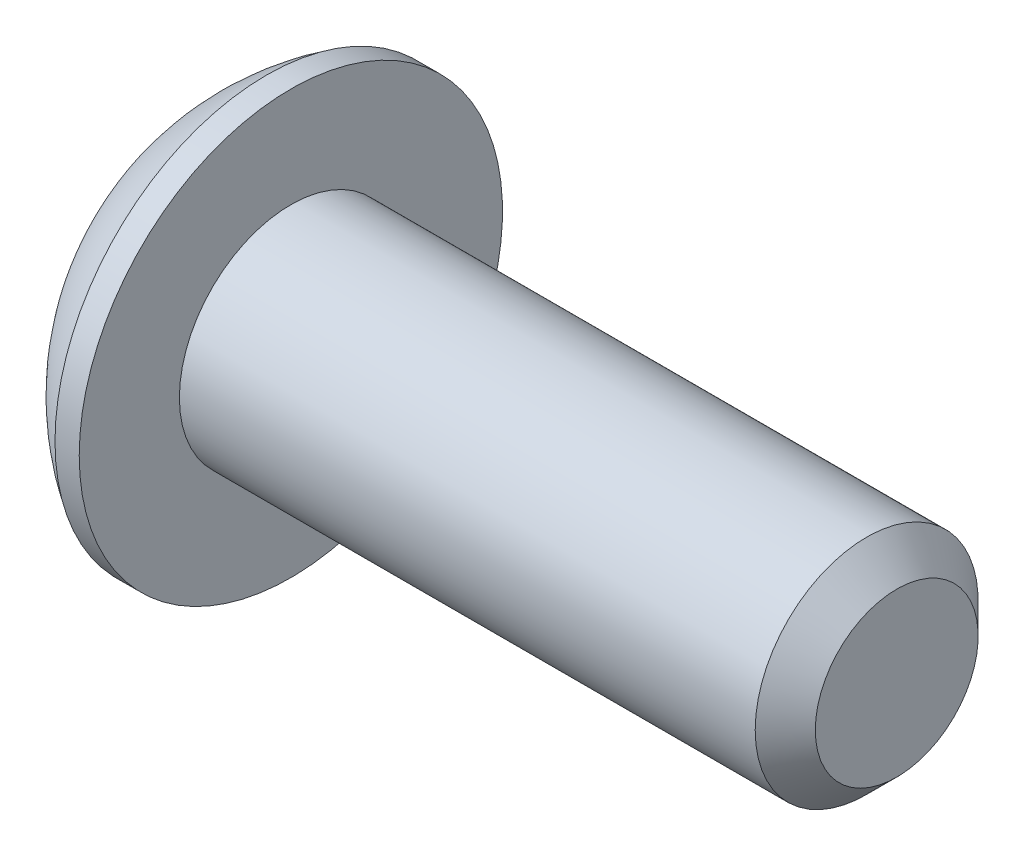
ISO-10303-21;
HEADER;
FILE_DESCRIPTION(('STEP AP214'),'2;1');
FILE_NAME('part.step','',(''),(''),'','','');
FILE_SCHEMA(('AUTOMOTIVE_DESIGN { 1 0 10303 214 1 1 1 1 }'));
ENDSEC;
DATA;
#1=APPLICATION_CONTEXT('core data for automotive mechanical design processes');
#2=APPLICATION_PROTOCOL_DEFINITION('international standard','automotive_design',2000,#1);
#3=PRODUCT_CONTEXT('',#1,'mechanical');
#4=PRODUCT('Part','Part','',(#3));
#5=PRODUCT_RELATED_PRODUCT_CATEGORY('part','',(#4));
#6=PRODUCT_DEFINITION_FORMATION('','',#4);
#7=PRODUCT_DEFINITION_CONTEXT('part definition',#1,'design');
#8=PRODUCT_DEFINITION('design','',#6,#7);
#9=PRODUCT_DEFINITION_SHAPE('','',#8);
#10=(LENGTH_UNIT() NAMED_UNIT(*) SI_UNIT(.MILLI.,.METRE.));
#11=(NAMED_UNIT(*) PLANE_ANGLE_UNIT() SI_UNIT($,.RADIAN.));
#12=(NAMED_UNIT(*) SI_UNIT($,.STERADIAN.) SOLID_ANGLE_UNIT());
#13=UNCERTAINTY_MEASURE_WITH_UNIT(LENGTH_MEASURE(1.E-05),#10,'distance_accuracy_value','');
#14=(GEOMETRIC_REPRESENTATION_CONTEXT(3) GLOBAL_UNCERTAINTY_ASSIGNED_CONTEXT((#13)) GLOBAL_UNIT_ASSIGNED_CONTEXT((#10,
#11,#12)) REPRESENTATION_CONTEXT('',''));
#15=CARTESIAN_POINT('',(0.,0.,0.));
#16=DIRECTION('',(0.,0.,1.));
#17=DIRECTION('',(1.,0.,0.));
#18=AXIS2_PLACEMENT_3D('',#15,#16,#17);
#19=CARTESIAN_POINT('',(0.,0.,0.));
#20=DIRECTION('',(-1.,0.,0.));
#21=DIRECTION('',(0.,0.,1.));
#22=AXIS2_PLACEMENT_3D('',#19,#20,#21);
#23=PLANE('',#22);
#24=CARTESIAN_POINT('',(0.,0.,0.));
#25=DIRECTION('',(-1.,0.,0.));
#26=DIRECTION('',(0.,0.,1.));
#27=AXIS2_PLACEMENT_3D('',#24,#25,#26);
#28=CIRCLE('',#27,1.6637);
#29=CARTESIAN_POINT('',(0.,1.6637,0.));
#30=VERTEX_POINT('',#29);
#31=EDGE_CURVE('E11',#30,#30,#28,.T.);
#32=ORIENTED_EDGE('',*,*,#31,.T.);
#33=EDGE_LOOP('',(#32));
#34=FACE_BOUND('',#33,.T.);
#35=DIRECTION('',(0.,-1.,0.));
#36=VECTOR('',#35,1.);
#37=CARTESIAN_POINT('',(0.,-0.571923176659243,0.9906));
#38=LINE('',#37,#36);
#39=CARTESIAN_POINT('',(0.,0.571923176659244,0.990600000000001));
#40=VERTEX_POINT('',#39);
#41=CARTESIAN_POINT('',(0.,-0.571923176659243,0.9906));
#42=VERTEX_POINT('',#41);
#43=EDGE_CURVE('E50',#40,#42,#38,.T.);
#44=ORIENTED_EDGE('',*,*,#43,.T.);
#45=DIRECTION('',(0.,-0.499999999999999,-0.866025403784439));
#46=VECTOR('',#45,1.);
#47=CARTESIAN_POINT('',(0.,-1.14384635331848,0.));
#48=LINE('',#47,#46);
#49=CARTESIAN_POINT('',(0.,-1.14384635331848,0.));
#50=VERTEX_POINT('',#49);
#51=EDGE_CURVE('E369',#42,#50,#48,.T.);
#52=ORIENTED_EDGE('',*,*,#51,.T.);
#53=DIRECTION('',(0.,0.499999999999999,-0.866025403784439));
#54=VECTOR('',#53,1.);
#55=CARTESIAN_POINT('',(0.,-0.571923176659242,-0.9906));
#56=LINE('',#55,#54);
#57=CARTESIAN_POINT('',(0.,-0.571923176659242,-0.9906));
#58=VERTEX_POINT('',#57);
#59=EDGE_CURVE('E130',#50,#58,#56,.T.);
#60=ORIENTED_EDGE('',*,*,#59,.T.);
#61=DIRECTION('',(0.,1.,0.));
#62=VECTOR('',#61,1.);
#63=CARTESIAN_POINT('',(0.,0.571923176659244,-0.9906));
#64=LINE('',#63,#62);
#65=CARTESIAN_POINT('',(0.,0.571923176659244,-0.9906));
#66=VERTEX_POINT('',#65);
#67=EDGE_CURVE('E372',#58,#66,#64,.T.);
#68=ORIENTED_EDGE('',*,*,#67,.T.);
#69=DIRECTION('',(0.,0.5,0.866025403784439));
#70=VECTOR('',#69,1.);
#71=CARTESIAN_POINT('',(0.,1.14384635331849,0.));
#72=LINE('',#71,#70);
#73=CARTESIAN_POINT('',(0.,1.14384635331849,0.));
#74=VERTEX_POINT('',#73);
#75=EDGE_CURVE('E374',#66,#74,#72,.T.);
#76=ORIENTED_EDGE('',*,*,#75,.T.);
#77=DIRECTION('',(0.,-0.5,0.866025403784439));
#78=VECTOR('',#77,1.);
#79=CARTESIAN_POINT('',(0.,0.571923176659244,0.990600000000001));
#80=LINE('',#79,#78);
#81=EDGE_CURVE('E376',#74,#40,#80,.T.);
#82=ORIENTED_EDGE('',*,*,#81,.T.);
#83=EDGE_LOOP('',(#44,#52,#60,#68,#76,#82));
#84=FACE_BOUND('',#83,.T.);
#85=ADVANCED_FACE('F36',(#34,#84),#23,.T.);
#86=CARTESIAN_POINT('',(3.55485043103449,0.,0.));
#87=DIRECTION('',(-1.,0.,0.));
#88=DIRECTION('',(0.,1.,0.));
#89=AXIS2_PLACEMENT_3D('',#86,#87,#88);
#90=SPHERICAL_SURFACE('',#89,3.92490245446);
#91=CARTESIAN_POINT('',(1.4732,0.,0.));
#92=DIRECTION('',(-1.,0.,0.));
#93=DIRECTION('',(0.,0.,1.));
#94=AXIS2_PLACEMENT_3D('',#91,#92,#93);
#95=CIRCLE('',#94,3.3274);
#96=CARTESIAN_POINT('',(1.4732,3.3274,0.));
#97=VERTEX_POINT('',#96);
#98=EDGE_CURVE('E43',#97,#97,#95,.T.);
#99=CARTESIAN_POINT('',(1.4732,3.3274,0.));
#100=CARTESIAN_POINT('',(1.45330383338302,3.31495281350127,0.));
#101=CARTESIAN_POINT('',(1.43351933465701,3.30232713364523,0.));
#102=CARTESIAN_POINT('',(1.39417998096444,3.27672293945236,0.));
#103=CARTESIAN_POINT('',(1.37462512599787,3.26374442511553,0.));
#104=CARTESIAN_POINT('',(1.33575136780167,3.23743871419496,0.));
#105=CARTESIAN_POINT('',(1.31643246457203,3.22411151761122,0.));
#106=CARTESIAN_POINT('',(1.27803682210257,3.19711273705128,0.));
#107=CARTESIAN_POINT('',(1.25896008286274,3.18344115307508,0.));
#108=CARTESIAN_POINT('',(1.22105490800766,3.15575799525025,0.));
#109=CARTESIAN_POINT('',(1.20222647239241,3.14174642140161,0.));
#110=CARTESIAN_POINT('',(1.1648239631005,3.11338779293801,0.));
#111=CARTESIAN_POINT('',(1.14624988942385,3.09904073832305,0.));
#112=CARTESIAN_POINT('',(1.1093620808555,3.07001576479871,0.));
#113=CARTESIAN_POINT('',(1.09104834596381,3.05533784588932,0.));
#114=CARTESIAN_POINT('',(1.05468710793785,3.02565586687034,0.));
#115=CARTESIAN_POINT('',(1.03663960480358,3.01065180676075,0.));
#116=CARTESIAN_POINT('',(1.00081663762422,2.98032237333929,0.));
#117=CARTESIAN_POINT('',(0.983041173579129,2.96499700002743,0.));
#118=CARTESIAN_POINT('',(0.947768004365814,2.93402987160278,0.));
#119=CARTESIAN_POINT('',(0.930270299197587,2.91838811648999,0.));
#120=CARTESIAN_POINT('',(0.895558278150387,2.88679325766719,0.));
#121=CARTESIAN_POINT('',(0.878343962271413,2.87084015395718,0.));
#122=CARTESIAN_POINT('',(0.844204259025566,2.83862773133017,0.));
#123=CARTESIAN_POINT('',(0.827278871658694,2.82236841241317,0.));
#124=CARTESIAN_POINT('',(0.79372247168862,2.78954879129617,0.));
#125=CARTESIAN_POINT('',(0.777091459085419,2.77298848909616,0.));
#126=CARTESIAN_POINT('',(0.744129160170298,2.73957223018758,0.));
#127=CARTESIAN_POINT('',(0.727797873858378,2.722716273479,0.));
#128=CARTESIAN_POINT('',(0.695440282607511,2.68871412946341,0.));
#129=CARTESIAN_POINT('',(0.679413977668563,2.6715679421564,0.));
#130=CARTESIAN_POINT('',(0.647671506108413,2.63699085424448,0.));
#131=CARTESIAN_POINT('',(0.631955339487211,2.61955995363958,0.));
#132=CARTESIAN_POINT('',(0.600838201711009,2.58441904804749,0.));
#133=CARTESIAN_POINT('',(0.58543723055601,2.5667090430603,0.));
#134=CARTESIAN_POINT('',(0.554955439437071,2.53101562742945,0.));
#135=CARTESIAN_POINT('',(0.539874619473131,2.51303221678579,0.));
#136=CARTESIAN_POINT('',(0.510037983442906,2.47679777654429,0.));
#137=CARTESIAN_POINT('',(0.495282167376621,2.45854674694645,0.));
#138=CARTESIAN_POINT('',(0.466100287268539,2.42178294161331,0.));
#139=CARTESIAN_POINT('',(0.451674223226742,2.40327016587801,0.));
#140=CARTESIAN_POINT('',(0.423156489186869,2.36598882531137,0.));
#141=CARTESIAN_POINT('',(0.409064819188794,2.34722026048002,0.));
#142=CARTESIAN_POINT('',(0.381220407654212,2.30943338107051,0.));
#143=CARTESIAN_POINT('',(0.367467666117707,2.29041506649236,0.));
#144=CARTESIAN_POINT('',(0.340305536863939,2.25213480730286,0.));
#145=CARTESIAN_POINT('',(0.326896149146676,2.23287286269151,0.));
#146=CARTESIAN_POINT('',(0.300425042403801,2.19411154154494,0.));
#147=CARTESIAN_POINT('',(0.287363323378189,2.17461216500972,0.));
#148=CARTESIAN_POINT('',(0.261591757021413,2.135382254524,0.));
#149=CARTESIAN_POINT('',(0.248881909690249,2.11565172057349,0.));
#150=CARTESIAN_POINT('',(0.223818176487825,2.07596584415351,0.));
#151=CARTESIAN_POINT('',(0.211464290616565,2.05601050168404,0.));
#152=CARTESIAN_POINT('',(0.187116455603135,2.01588142943931,0.));
#153=CARTESIAN_POINT('',(0.175122506460966,1.99570769966405,0.));
#154=CARTESIAN_POINT('',(0.15149840418644,1.9551483443759,0.));
#155=CARTESIAN_POINT('',(0.139868251054084,1.93476271886302,0.));
#156=CARTESIAN_POINT('',(0.116975483644661,1.89378613154432,0.));
#157=CARTESIAN_POINT('',(0.105712869367595,1.87319516973851,0.));
#158=CARTESIAN_POINT('',(0.0835588019074145,1.83181453649859,0.));
#159=CARTESIAN_POINT('',(0.0726673487243012,1.81102486506448,0.));
#160=CARTESIAN_POINT('',(0.0512591149920279,1.76925349889341,0.));
#161=CARTESIAN_POINT('',(0.0407423344428681,1.74827180415644,0.));
#162=CARTESIAN_POINT('',(0.0200868043622357,1.7061231554675,0.));
#163=CARTESIAN_POINT('',(0.00994805483076323,1.68495620151554,0.));
#164=CARTESIAN_POINT('',(0.,1.6637,0.));
#165=B_SPLINE_CURVE_WITH_KNOTS('',3,(#99,#100,#101,#102,#103,#104,#105,#106,#107,#108,#109,#110,
#111,#112,#113,#114,#115,#116,#117,#118,#119,#120,#121,#122,#123,#124,#125,#126,#127,#128,#129,
#130,#131,#132,#133,#134,#135,#136,#137,#138,#139,#140,#141,#142,#143,#144,#145,#146,#147,#148,
#149,#150,#151,#152,#153,#154,#155,#156,#157,#158,#159,#160,#161,#162,#163,#164),.UNSPECIFIED.,
.F.,.F.,(4,2,2,2,2,2,2,2,2,2,2,2,2,2,2,2,2,2,2,2,2,2,2,2,2,2,2,2,2,2,2,2,4),(0.,
0.0704057950343174,0.140811590068635,0.211217385102953,0.281623180137271,0.352028975171588,
0.422434770205907,0.492840565240224,0.563246360274542,0.633652155308859,0.704057950343177,
0.774463745377495,0.844869540411813,0.91527533544613,0.985681130480448,1.05608692551477,
1.12649272054908,1.1968985155834,1.26730431061772,1.33771010565204,1.40811590068635,
1.47852169572067,1.54892749075499,1.61933328578931,1.68973908082363,1.76014487585794,
1.83055067089226,1.90095646592658,1.9713622609609,2.04176805599521,2.11217385102953,
2.18257964606385,2.25298544109817),.UNSPECIFIED.);
#166=EDGE_CURVE('BSEAM157',#97,#30,#165,.T.);
#167=ORIENTED_EDGE('',*,*,#98,.T.);
#168=ORIENTED_EDGE('',*,*,#31,.F.);
#169=ORIENTED_EDGE('',*,*,#166,.T.);
#170=ORIENTED_EDGE('',*,*,#166,.F.);
#171=EDGE_LOOP('',(#167,#169,#168,#170));
#172=FACE_BOUND('',#171,.T.);
#173=ADVANCED_FACE('F157',(#172),#90,.T.);
#174=CARTESIAN_POINT('',(0.,0.,0.));
#175=DIRECTION('',(-1.,0.,0.));
#176=DIRECTION('',(0.,0.,1.));
#177=AXIS2_PLACEMENT_3D('',#174,#175,#176);
#178=CYLINDRICAL_SURFACE('',#177,3.3274);
#179=ORIENTED_EDGE('',*,*,#98,.F.);
#180=EDGE_LOOP('',(#179));
#181=FACE_BOUND('',#180,.T.);
#182=CARTESIAN_POINT('',(1.8542,0.,0.));
#183=DIRECTION('',(-1.,0.,0.));
#184=DIRECTION('',(0.,0.,1.));
#185=AXIS2_PLACEMENT_3D('',#182,#183,#184);
#186=CIRCLE('',#185,3.3274);
#187=CARTESIAN_POINT('',(1.8542,0.,3.3274));
#188=VERTEX_POINT('',#187);
#189=EDGE_CURVE('E152',#188,#188,#186,.T.);
#190=ORIENTED_EDGE('',*,*,#189,.T.);
#191=EDGE_LOOP('',(#190));
#192=FACE_BOUND('',#191,.T.);
#193=ADVANCED_FACE('F160',(#181,#192),#178,.T.);
#194=CARTESIAN_POINT('',(1.8542,1.7526,0.));
#195=DIRECTION('',(-1.,0.,0.));
#196=DIRECTION('',(0.,0.,1.));
#197=AXIS2_PLACEMENT_3D('',#194,#195,#196);
#198=PLANE('',#197);
#199=ORIENTED_EDGE('',*,*,#189,.F.);
#200=EDGE_LOOP('',(#199));
#201=FACE_BOUND('',#200,.T.);
#202=CARTESIAN_POINT('',(1.8542,0.,0.));
#203=DIRECTION('',(-1.,0.,0.));
#204=DIRECTION('',(0.,0.,1.));
#205=AXIS2_PLACEMENT_3D('',#202,#203,#204);
#206=CIRCLE('',#205,1.7526);
#207=CARTESIAN_POINT('',(1.8542,0.,1.7526));
#208=VERTEX_POINT('',#207);
#209=EDGE_CURVE('E149',#208,#208,#206,.T.);
#210=ORIENTED_EDGE('',*,*,#209,.T.);
#211=EDGE_LOOP('',(#210));
#212=FACE_BOUND('',#211,.T.);
#213=ADVANCED_FACE('F163',(#201,#212),#198,.F.);
#214=CARTESIAN_POINT('',(0.,0.,0.));
#215=DIRECTION('',(-1.,0.,0.));
#216=DIRECTION('',(0.,0.,1.));
#217=AXIS2_PLACEMENT_3D('',#214,#215,#216);
#218=CYLINDRICAL_SURFACE('',#217,1.7526);
#219=ORIENTED_EDGE('',*,*,#209,.F.);
#220=EDGE_LOOP('',(#219));
#221=FACE_BOUND('',#220,.T.);
#222=CARTESIAN_POINT('',(10.90676,0.,0.));
#223=DIRECTION('',(-1.,0.,0.));
#224=DIRECTION('',(0.,0.,1.));
#225=AXIS2_PLACEMENT_3D('',#222,#223,#224);
#226=CIRCLE('',#225,1.7526);
#227=CARTESIAN_POINT('',(10.90676,0.,1.7526));
#228=VERTEX_POINT('',#227);
#229=EDGE_CURVE('E146',#228,#228,#226,.T.);
#230=ORIENTED_EDGE('',*,*,#229,.T.);
#231=EDGE_LOOP('',(#230));
#232=FACE_BOUND('',#231,.T.);
#233=ADVANCED_FACE('F169',(#221,#232),#218,.T.);
#234=CARTESIAN_POINT('',(11.3792,0.,0.));
#235=DIRECTION('',(-1.,0.,0.));
#236=DIRECTION('',(0.,0.,1.));
#237=AXIS2_PLACEMENT_3D('',#234,#235,#236);
#238=CONICAL_SURFACE('',#237,1.28016,0.78539816339748);
#239=ORIENTED_EDGE('',*,*,#229,.F.);
#240=EDGE_LOOP('',(#239));
#241=FACE_BOUND('',#240,.T.);
#242=CARTESIAN_POINT('',(11.3792,0.,0.));
#243=DIRECTION('',(-1.,0.,0.));
#244=DIRECTION('',(0.,0.,1.));
#245=AXIS2_PLACEMENT_3D('',#242,#243,#244);
#246=CIRCLE('',#245,1.28016);
#247=CARTESIAN_POINT('',(11.3792,0.,1.28016));
#248=VERTEX_POINT('',#247);
#249=EDGE_CURVE('E142',#248,#248,#246,.T.);
#250=ORIENTED_EDGE('',*,*,#249,.T.);
#251=EDGE_LOOP('',(#250));
#252=FACE_BOUND('',#251,.T.);
#253=ADVANCED_FACE('F175',(#241,#252),#238,.T.);
#254=CARTESIAN_POINT('',(11.3792,0.,0.));
#255=DIRECTION('',(-1.,0.,0.));
#256=DIRECTION('',(0.,0.,1.));
#257=AXIS2_PLACEMENT_3D('',#254,#255,#256);
#258=PLANE('',#257);
#259=ORIENTED_EDGE('',*,*,#249,.F.);
#260=EDGE_LOOP('',(#259));
#261=FACE_BOUND('',#260,.T.);
#262=ADVANCED_FACE('F181',(#261),#258,.F.);
#263=CARTESIAN_POINT('',(1.1176,-1.14384635331848,0.));
#264=DIRECTION('',(0.,0.866025403784439,-0.499999999999999));
#265=DIRECTION('',(0.,0.499999999999999,0.866025403784439));
#266=AXIS2_PLACEMENT_3D('',#263,#264,#265);
#267=PLANE('',#266);
#268=DIRECTION('',(0.,-0.499999999999999,-0.866025403784439));
#269=VECTOR('',#268,1.);
#270=CARTESIAN_POINT('',(1.1176,-1.14384635331848,0.));
#271=LINE('',#270,#269);
#272=CARTESIAN_POINT('',(1.1176,-0.571923176659243,0.9906));
#273=VERTEX_POINT('',#272);
#274=CARTESIAN_POINT('',(1.1176,-0.857884764988864,0.495299999999998));
#275=VERTEX_POINT('',#274);
#276=EDGE_CURVE('E116',#273,#275,#271,.T.);
#277=ORIENTED_EDGE('',*,*,#276,.T.);
#278=CARTESIAN_POINT('',(1.1176,-1.14384635331848,0.));
#279=VERTEX_POINT('',#278);
#280=EDGE_CURVE('E111',#275,#279,#271,.T.);
#281=ORIENTED_EDGE('',*,*,#280,.T.);
#282=DIRECTION('',(-1.,0.,0.));
#283=VECTOR('',#282,1.);
#284=CARTESIAN_POINT('',(1.1176,-1.14384635331848,0.));
#285=LINE('',#284,#283);
#286=EDGE_CURVE('E113',#279,#50,#285,.T.);
#287=ORIENTED_EDGE('',*,*,#286,.T.);
#288=ORIENTED_EDGE('',*,*,#51,.F.);
#289=DIRECTION('',(-1.,0.,0.));
#290=VECTOR('',#289,1.);
#291=CARTESIAN_POINT('',(1.1176,-0.571923176659243,0.9906));
#292=LINE('',#291,#290);
#293=EDGE_CURVE('E364',#273,#42,#292,.T.);
#294=ORIENTED_EDGE('',*,*,#293,.F.);
#295=EDGE_LOOP('',(#277,#281,#287,#288,#294));
#296=FACE_BOUND('',#295,.T.);
#297=ADVANCED_FACE('F112',(#296),#267,.T.);
#298=CARTESIAN_POINT('',(1.1176,-0.571923176659242,-0.9906));
#299=DIRECTION('',(0.,0.866025403784439,0.499999999999999));
#300=DIRECTION('',(0.,-0.499999999999999,0.866025403784439));
#301=AXIS2_PLACEMENT_3D('',#298,#299,#300);
#302=PLANE('',#301);
#303=DIRECTION('',(0.,0.499999999999999,-0.866025403784439));
#304=VECTOR('',#303,1.);
#305=CARTESIAN_POINT('',(1.1176,-0.571923176659242,-0.9906));
#306=LINE('',#305,#304);
#307=CARTESIAN_POINT('',(1.1176,-0.857884764988865,-0.495299999999999));
#308=VERTEX_POINT('',#307);
#309=EDGE_CURVE('E58',#279,#308,#306,.T.);
#310=ORIENTED_EDGE('',*,*,#309,.T.);
#311=CARTESIAN_POINT('',(1.1176,-0.571923176659242,-0.9906));
#312=VERTEX_POINT('',#311);
#313=EDGE_CURVE('E125',#308,#312,#306,.T.);
#314=ORIENTED_EDGE('',*,*,#313,.T.);
#315=DIRECTION('',(-1.,0.,0.));
#316=VECTOR('',#315,1.);
#317=CARTESIAN_POINT('',(1.1176,-0.571923176659242,-0.9906));
#318=LINE('',#317,#316);
#319=EDGE_CURVE('E132',#312,#58,#318,.T.);
#320=ORIENTED_EDGE('',*,*,#319,.T.);
#321=ORIENTED_EDGE('',*,*,#59,.F.);
#322=ORIENTED_EDGE('',*,*,#286,.F.);
#323=EDGE_LOOP('',(#310,#314,#320,#321,#322));
#324=FACE_BOUND('',#323,.T.);
#325=ADVANCED_FACE('F128',(#324),#302,.T.);
#326=CARTESIAN_POINT('',(1.1176,0.571923176659244,-0.9906));
#327=DIRECTION('',(0.,0.,1.));
#328=DIRECTION('',(1.,0.,0.));
#329=AXIS2_PLACEMENT_3D('',#326,#327,#328);
#330=PLANE('',#329);
#331=DIRECTION('',(0.,1.,0.));
#332=VECTOR('',#331,1.);
#333=CARTESIAN_POINT('',(1.1176,0.571923176659244,-0.9906));
#334=LINE('',#333,#332);
#335=CARTESIAN_POINT('',(1.1176,0.,-0.9906));
#336=VERTEX_POINT('',#335);
#337=EDGE_CURVE('E394',#312,#336,#334,.T.);
#338=ORIENTED_EDGE('',*,*,#337,.T.);
#339=CARTESIAN_POINT('',(1.1176,0.571923176659244,-0.9906));
#340=VERTEX_POINT('',#339);
#341=EDGE_CURVE('E124',#336,#340,#334,.T.);
#342=ORIENTED_EDGE('',*,*,#341,.T.);
#343=DIRECTION('',(-1.,0.,0.));
#344=VECTOR('',#343,1.);
#345=CARTESIAN_POINT('',(1.1176,0.571923176659244,-0.9906));
#346=LINE('',#345,#344);
#347=EDGE_CURVE('E137',#340,#66,#346,.T.);
#348=ORIENTED_EDGE('',*,*,#347,.T.);
#349=ORIENTED_EDGE('',*,*,#67,.F.);
#350=ORIENTED_EDGE('',*,*,#319,.F.);
#351=EDGE_LOOP('',(#338,#342,#348,#349,#350));
#352=FACE_BOUND('',#351,.T.);
#353=ADVANCED_FACE('F243',(#352),#330,.T.);
#354=CARTESIAN_POINT('',(1.1176,1.14384635331849,0.));
#355=DIRECTION('',(0.,-0.866025403784439,0.5));
#356=DIRECTION('',(0.,-0.5,-0.866025403784439));
#357=AXIS2_PLACEMENT_3D('',#354,#355,#356);
#358=PLANE('',#357);
#359=DIRECTION('',(0.,0.5,0.866025403784439));
#360=VECTOR('',#359,1.);
#361=CARTESIAN_POINT('',(1.1176,1.14384635331849,0.));
#362=LINE('',#361,#360);
#363=CARTESIAN_POINT('',(1.1176,0.857884764988866,-0.495300000000001));
#364=VERTEX_POINT('',#363);
#365=EDGE_CURVE('E398',#340,#364,#362,.T.);
#366=ORIENTED_EDGE('',*,*,#365,.T.);
#367=CARTESIAN_POINT('',(1.1176,1.14384635331849,0.));
#368=VERTEX_POINT('',#367);
#369=EDGE_CURVE('E396',#364,#368,#362,.T.);
#370=ORIENTED_EDGE('',*,*,#369,.T.);
#371=DIRECTION('',(-1.,0.,0.));
#372=VECTOR('',#371,1.);
#373=CARTESIAN_POINT('',(1.1176,1.14384635331849,0.));
#374=LINE('',#373,#372);
#375=EDGE_CURVE('E380',#368,#74,#374,.T.);
#376=ORIENTED_EDGE('',*,*,#375,.T.);
#377=ORIENTED_EDGE('',*,*,#75,.F.);
#378=ORIENTED_EDGE('',*,*,#347,.F.);
#379=EDGE_LOOP('',(#366,#370,#376,#377,#378));
#380=FACE_BOUND('',#379,.T.);
#381=ADVANCED_FACE('F252',(#380),#358,.T.);
#382=CARTESIAN_POINT('',(1.1176,0.571923176659244,0.990600000000001));
#383=DIRECTION('',(0.,-0.866025403784439,-0.5));
#384=DIRECTION('',(0.,0.5,-0.866025403784439));
#385=AXIS2_PLACEMENT_3D('',#382,#383,#384);
#386=PLANE('',#385);
#387=DIRECTION('',(0.,-0.5,0.866025403784439));
#388=VECTOR('',#387,1.);
#389=CARTESIAN_POINT('',(1.1176,0.571923176659244,0.990600000000001));
#390=LINE('',#389,#388);
#391=CARTESIAN_POINT('',(1.1176,0.857884764988866,0.495300000000001));
#392=VERTEX_POINT('',#391);
#393=EDGE_CURVE('E359',#368,#392,#390,.T.);
#394=ORIENTED_EDGE('',*,*,#393,.T.);
#395=CARTESIAN_POINT('',(1.1176,0.571923176659244,0.990600000000001));
#396=VERTEX_POINT('',#395);
#397=EDGE_CURVE('E355',#392,#396,#390,.T.);
#398=ORIENTED_EDGE('',*,*,#397,.T.);
#399=DIRECTION('',(-1.,0.,0.));
#400=VECTOR('',#399,1.);
#401=CARTESIAN_POINT('',(1.1176,0.571923176659244,0.990600000000001));
#402=LINE('',#401,#400);
#403=EDGE_CURVE('E363',#396,#40,#402,.T.);
#404=ORIENTED_EDGE('',*,*,#403,.T.);
#405=ORIENTED_EDGE('',*,*,#81,.F.);
#406=ORIENTED_EDGE('',*,*,#375,.F.);
#407=EDGE_LOOP('',(#394,#398,#404,#405,#406));
#408=FACE_BOUND('',#407,.T.);
#409=ADVANCED_FACE('F262',(#408),#386,.T.);
#410=CARTESIAN_POINT('',(1.1176,-0.571923176659243,0.9906));
#411=DIRECTION('',(0.,0.,-1.));
#412=DIRECTION('',(0.,1.,0.));
#413=AXIS2_PLACEMENT_3D('',#410,#411,#412);
#414=PLANE('',#413);
#415=DIRECTION('',(0.,-1.,0.));
#416=VECTOR('',#415,1.);
#417=CARTESIAN_POINT('',(1.1176,-0.571923176659243,0.9906));
#418=LINE('',#417,#416);
#419=CARTESIAN_POINT('',(1.1176,0.,0.9906));
#420=VERTEX_POINT('',#419);
#421=EDGE_CURVE('E354',#396,#420,#418,.T.);
#422=ORIENTED_EDGE('',*,*,#421,.T.);
#423=EDGE_CURVE('E357',#420,#273,#418,.T.);
#424=ORIENTED_EDGE('',*,*,#423,.T.);
#425=ORIENTED_EDGE('',*,*,#293,.T.);
#426=ORIENTED_EDGE('',*,*,#43,.F.);
#427=ORIENTED_EDGE('',*,*,#403,.F.);
#428=EDGE_LOOP('',(#422,#424,#425,#426,#427));
#429=FACE_BOUND('',#428,.T.);
#430=ADVANCED_FACE('F272',(#429),#414,.T.);
#431=CARTESIAN_POINT('',(1.1176,-1.71576952997773,-0.9906));
#432=DIRECTION('',(1.,0.,0.));
#433=DIRECTION('',(0.,0.,-1.));
#434=AXIS2_PLACEMENT_3D('',#431,#432,#433);
#435=PLANE('',#434);
#436=CARTESIAN_POINT('',(1.1176,0.,0.));
#437=DIRECTION('',(-1.,0.,0.));
#438=DIRECTION('',(0.,0.,1.));
#439=AXIS2_PLACEMENT_3D('',#436,#437,#438);
#440=CIRCLE('',#439,0.9906);
#441=EDGE_CURVE('E401',#364,#336,#440,.T.);
#442=ORIENTED_EDGE('',*,*,#441,.F.);
#443=ORIENTED_EDGE('',*,*,#365,.F.);
#444=ORIENTED_EDGE('',*,*,#341,.F.);
#445=EDGE_LOOP('',(#442,#443,#444));
#446=FACE_BOUND('',#445,.T.);
#447=ADVANCED_FACE('F282',(#446),#435,.F.);
#448=EDGE_CURVE('E143',#392,#364,#440,.T.);
#449=ORIENTED_EDGE('',*,*,#448,.F.);
#450=ORIENTED_EDGE('',*,*,#393,.F.);
#451=ORIENTED_EDGE('',*,*,#369,.F.);
#452=EDGE_LOOP('',(#449,#450,#451));
#453=FACE_BOUND('',#452,.T.);
#454=ADVANCED_FACE('F292',(#453),#435,.F.);
#455=EDGE_CURVE('E136',#420,#392,#440,.T.);
#456=ORIENTED_EDGE('',*,*,#455,.F.);
#457=ORIENTED_EDGE('',*,*,#421,.F.);
#458=ORIENTED_EDGE('',*,*,#397,.F.);
#459=EDGE_LOOP('',(#456,#457,#458));
#460=FACE_BOUND('',#459,.T.);
#461=ADVANCED_FACE('F303',(#460),#435,.F.);
#462=EDGE_CURVE('E131',#275,#420,#440,.T.);
#463=ORIENTED_EDGE('',*,*,#462,.F.);
#464=ORIENTED_EDGE('',*,*,#276,.F.);
#465=ORIENTED_EDGE('',*,*,#423,.F.);
#466=EDGE_LOOP('',(#463,#464,#465));
#467=FACE_BOUND('',#466,.T.);
#468=ADVANCED_FACE('F312',(#467),#435,.F.);
#469=EDGE_CURVE('E122',#308,#275,#440,.T.);
#470=ORIENTED_EDGE('',*,*,#469,.F.);
#471=ORIENTED_EDGE('',*,*,#309,.F.);
#472=ORIENTED_EDGE('',*,*,#280,.F.);
#473=EDGE_LOOP('',(#470,#471,#472));
#474=FACE_BOUND('',#473,.T.);
#475=ADVANCED_FACE('F121',(#474),#435,.F.);
#476=EDGE_CURVE('E395',#336,#308,#440,.T.);
#477=ORIENTED_EDGE('',*,*,#476,.F.);
#478=ORIENTED_EDGE('',*,*,#337,.F.);
#479=ORIENTED_EDGE('',*,*,#313,.F.);
#480=EDGE_LOOP('',(#477,#478,#479));
#481=FACE_BOUND('',#480,.T.);
#482=ADVANCED_FACE('F295',(#481),#435,.F.);
#483=CARTESIAN_POINT('',(1.68952317665925,0.,0.));
#484=DIRECTION('',(-1.,0.,0.));
#485=DIRECTION('',(0.,0.,1.));
#486=AXIS2_PLACEMENT_3D('',#483,#484,#485);
#487=CONICAL_SURFACE('',#486,0.,1.04719755119659);
#488=ORIENTED_EDGE('',*,*,#455,.T.);
#489=ORIENTED_EDGE('',*,*,#448,.T.);
#490=ORIENTED_EDGE('',*,*,#441,.T.);
#491=ORIENTED_EDGE('',*,*,#476,.T.);
#492=ORIENTED_EDGE('',*,*,#469,.T.);
#493=ORIENTED_EDGE('',*,*,#462,.T.);
#494=EDGE_LOOP('',(#488,#489,#490,#491,#492,#493));
#495=FACE_BOUND('',#494,.T.);
#496=CARTESIAN_POINT('',(1.68952317665925,0.,0.));
#497=VERTEX_POINT('',#496);
#498=VERTEX_LOOP('',#497);
#499=FACE_BOUND('',#498,.T.);
#500=ADVANCED_FACE('F336',(#495,#499),#487,.F.);
#501=CLOSED_SHELL('',(#85,#173,#193,#213,#233,#253,#262,#297,#325,#353,#381,#409,#430,#447,#454,
#461,#468,#475,#482,#500));
#502=MANIFOLD_SOLID_BREP('B2',#501);
#503=ADVANCED_BREP_SHAPE_REPRESENTATION('',(#18,#502),#14);
#504=SHAPE_DEFINITION_REPRESENTATION(#9,#503);
ENDSEC;
END-ISO-10303-21;
